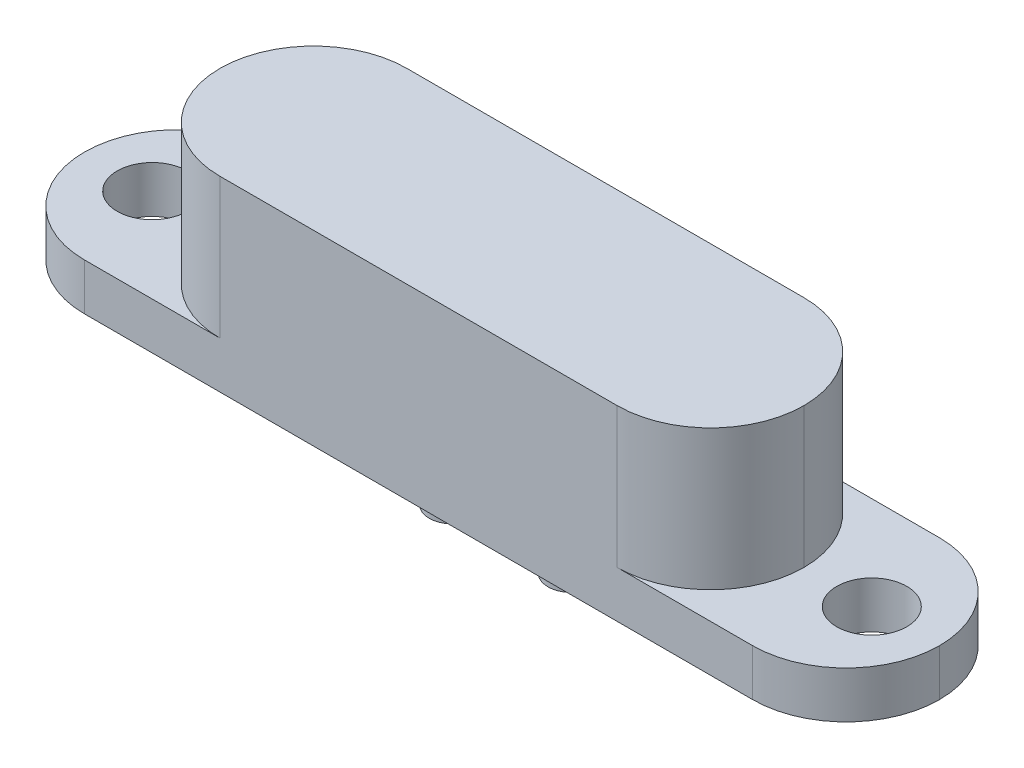
ISO-10303-21;
HEADER;
FILE_DESCRIPTION(('STEP AP214'),'2;1');
FILE_NAME('part.step','',(''),(''),'','','');
FILE_SCHEMA(('AUTOMOTIVE_DESIGN { 1 0 10303 214 1 1 1 1 }'));
ENDSEC;
DATA;
#1=APPLICATION_CONTEXT('core data for automotive mechanical design processes');
#2=APPLICATION_PROTOCOL_DEFINITION('international standard','automotive_design',2000,#1);
#3=PRODUCT_CONTEXT('',#1,'mechanical');
#4=PRODUCT('Part','Part','',(#3));
#5=PRODUCT_RELATED_PRODUCT_CATEGORY('part','',(#4));
#6=PRODUCT_DEFINITION_FORMATION('','',#4);
#7=PRODUCT_DEFINITION_CONTEXT('part definition',#1,'design');
#8=PRODUCT_DEFINITION('design','',#6,#7);
#9=PRODUCT_DEFINITION_SHAPE('','',#8);
#10=(LENGTH_UNIT() NAMED_UNIT(*) SI_UNIT(.MILLI.,.METRE.));
#11=(NAMED_UNIT(*) PLANE_ANGLE_UNIT() SI_UNIT($,.RADIAN.));
#12=(NAMED_UNIT(*) SI_UNIT($,.STERADIAN.) SOLID_ANGLE_UNIT());
#13=UNCERTAINTY_MEASURE_WITH_UNIT(LENGTH_MEASURE(1.E-05),#10,'distance_accuracy_value','');
#14=(GEOMETRIC_REPRESENTATION_CONTEXT(3) GLOBAL_UNCERTAINTY_ASSIGNED_CONTEXT((#13)) GLOBAL_UNIT_ASSIGNED_CONTEXT((#10,
#11,#12)) REPRESENTATION_CONTEXT('',''));
#15=CARTESIAN_POINT('',(0.,0.,0.));
#16=DIRECTION('',(0.,0.,1.));
#17=DIRECTION('',(1.,0.,0.));
#18=AXIS2_PLACEMENT_3D('',#15,#16,#17);
#19=CARTESIAN_POINT('',(-6.25,4.,2.));
#20=DIRECTION('',(0.,0.,-1.));
#21=DIRECTION('',(-1.,0.,0.));
#22=AXIS2_PLACEMENT_3D('',#19,#20,#21);
#23=PLANE('',#22);
#24=DIRECTION('',(1.,0.,0.));
#25=VECTOR('',#24,1.);
#26=CARTESIAN_POINT('',(-6.25,0.,2.));
#27=LINE('',#26,#25);
#28=CARTESIAN_POINT('',(-7.15,0.,2.));
#29=VERTEX_POINT('',#28);
#30=CARTESIAN_POINT('',(7.15,0.,2.));
#31=VERTEX_POINT('',#30);
#32=EDGE_CURVE('E166',#29,#31,#27,.T.);
#33=ORIENTED_EDGE('',*,*,#32,.T.);
#34=DIRECTION('',(0.,-1.,0.));
#35=VECTOR('',#34,1.);
#36=CARTESIAN_POINT('',(7.15,4.,2.));
#37=LINE('',#36,#35);
#38=CARTESIAN_POINT('',(7.15,1.,2.));
#39=VERTEX_POINT('',#38);
#40=EDGE_CURVE('E178',#31,#39,#37,.F.);
#41=ORIENTED_EDGE('',*,*,#40,.T.);
#42=DIRECTION('',(1.,0.,0.));
#43=VECTOR('',#42,1.);
#44=CARTESIAN_POINT('',(-9.15,1.,2.));
#45=LINE('',#44,#43);
#46=CARTESIAN_POINT('',(4.25,1.,2.));
#47=VERTEX_POINT('',#46);
#48=EDGE_CURVE('E139',#47,#39,#45,.T.);
#49=ORIENTED_EDGE('',*,*,#48,.F.);
#50=DIRECTION('',(0.,-1.,0.));
#51=VECTOR('',#50,1.);
#52=CARTESIAN_POINT('',(4.25,4.,2.));
#53=LINE('',#52,#51);
#54=CARTESIAN_POINT('',(4.25,4.,2.));
#55=VERTEX_POINT('',#54);
#56=EDGE_CURVE('E150',#47,#55,#53,.F.);
#57=ORIENTED_EDGE('',*,*,#56,.T.);
#58=DIRECTION('',(1.,0.,0.));
#59=VECTOR('',#58,1.);
#60=CARTESIAN_POINT('',(-6.25,4.,2.));
#61=LINE('',#60,#59);
#62=CARTESIAN_POINT('',(-4.25,4.,2.));
#63=VERTEX_POINT('',#62);
#64=EDGE_CURVE('E155',#63,#55,#61,.T.);
#65=ORIENTED_EDGE('',*,*,#64,.F.);
#66=DIRECTION('',(0.,-1.,0.));
#67=VECTOR('',#66,1.);
#68=CARTESIAN_POINT('',(-4.25,0.,2.));
#69=LINE('',#68,#67);
#70=CARTESIAN_POINT('',(-4.25,1.,2.));
#71=VERTEX_POINT('',#70);
#72=EDGE_CURVE('E146',#63,#71,#69,.T.);
#73=ORIENTED_EDGE('',*,*,#72,.T.);
#74=CARTESIAN_POINT('',(-7.15,1.,2.));
#75=VERTEX_POINT('',#74);
#76=EDGE_CURVE('E127',#75,#71,#45,.T.);
#77=ORIENTED_EDGE('',*,*,#76,.F.);
#78=DIRECTION('',(0.,-1.,0.));
#79=VECTOR('',#78,1.);
#80=CARTESIAN_POINT('',(-7.15,0.,2.));
#81=LINE('',#80,#79);
#82=EDGE_CURVE('E176',#75,#29,#81,.T.);
#83=ORIENTED_EDGE('',*,*,#82,.T.);
#84=EDGE_LOOP('',(#33,#41,#49,#57,#65,#73,#77,#83));
#85=FACE_BOUND('',#84,.T.);
#86=ADVANCED_FACE('F39',(#85),#23,.F.);
#87=CARTESIAN_POINT('',(-6.25,4.,-2.));
#88=DIRECTION('',(0.,0.,-1.));
#89=DIRECTION('',(-1.,0.,0.));
#90=AXIS2_PLACEMENT_3D('',#87,#88,#89);
#91=PLANE('',#90);
#92=DIRECTION('',(1.,0.,0.));
#93=VECTOR('',#92,1.);
#94=CARTESIAN_POINT('',(-9.15,1.,-2.));
#95=LINE('',#94,#93);
#96=CARTESIAN_POINT('',(4.25,1.,-2.));
#97=VERTEX_POINT('',#96);
#98=CARTESIAN_POINT('',(7.15,1.,-2.));
#99=VERTEX_POINT('',#98);
#100=EDGE_CURVE('E138',#97,#99,#95,.T.);
#101=ORIENTED_EDGE('',*,*,#100,.T.);
#102=DIRECTION('',(0.,-1.,0.));
#103=VECTOR('',#102,1.);
#104=CARTESIAN_POINT('',(7.15,0.,-2.));
#105=LINE('',#104,#103);
#106=CARTESIAN_POINT('',(7.15,0.,-2.));
#107=VERTEX_POINT('',#106);
#108=EDGE_CURVE('E186',#99,#107,#105,.T.);
#109=ORIENTED_EDGE('',*,*,#108,.T.);
#110=DIRECTION('',(1.,0.,0.));
#111=VECTOR('',#110,1.);
#112=CARTESIAN_POINT('',(-6.25,0.,-2.));
#113=LINE('',#112,#111);
#114=CARTESIAN_POINT('',(-7.15,0.,-2.));
#115=VERTEX_POINT('',#114);
#116=EDGE_CURVE('E228',#115,#107,#113,.T.);
#117=ORIENTED_EDGE('',*,*,#116,.F.);
#118=DIRECTION('',(0.,-1.,0.));
#119=VECTOR('',#118,1.);
#120=CARTESIAN_POINT('',(-7.15,4.,-2.));
#121=LINE('',#120,#119);
#122=CARTESIAN_POINT('',(-7.15,1.,-2.));
#123=VERTEX_POINT('',#122);
#124=EDGE_CURVE('E62',#115,#123,#121,.F.);
#125=ORIENTED_EDGE('',*,*,#124,.T.);
#126=CARTESIAN_POINT('',(-4.25,1.,-2.));
#127=VERTEX_POINT('',#126);
#128=EDGE_CURVE('E219',#123,#127,#95,.T.);
#129=ORIENTED_EDGE('',*,*,#128,.T.);
#130=DIRECTION('',(0.,-1.,0.));
#131=VECTOR('',#130,1.);
#132=CARTESIAN_POINT('',(-4.25,4.,-2.));
#133=LINE('',#132,#131);
#134=CARTESIAN_POINT('',(-4.25,4.,-2.));
#135=VERTEX_POINT('',#134);
#136=EDGE_CURVE('E231',#127,#135,#133,.F.);
#137=ORIENTED_EDGE('',*,*,#136,.T.);
#138=DIRECTION('',(1.,0.,0.));
#139=VECTOR('',#138,1.);
#140=CARTESIAN_POINT('',(-6.25,4.,-2.));
#141=LINE('',#140,#139);
#142=CARTESIAN_POINT('',(4.25,4.,-2.));
#143=VERTEX_POINT('',#142);
#144=EDGE_CURVE('E227',#135,#143,#141,.T.);
#145=ORIENTED_EDGE('',*,*,#144,.T.);
#146=DIRECTION('',(0.,-1.,0.));
#147=VECTOR('',#146,1.);
#148=CARTESIAN_POINT('',(4.25,0.,-2.));
#149=LINE('',#148,#147);
#150=EDGE_CURVE('E236',#143,#97,#149,.T.);
#151=ORIENTED_EDGE('',*,*,#150,.T.);
#152=EDGE_LOOP('',(#101,#109,#117,#125,#129,#137,#145,#151));
#153=FACE_BOUND('',#152,.T.);
#154=ADVANCED_FACE('F257',(#153),#91,.T.);
#155=CARTESIAN_POINT('',(0.,4.,0.));
#156=DIRECTION('',(0.,1.,0.));
#157=DIRECTION('',(0.,0.,1.));
#158=AXIS2_PLACEMENT_3D('',#155,#156,#157);
#159=PLANE('',#158);
#160=CARTESIAN_POINT('',(4.25,4.,0.));
#161=DIRECTION('',(0.,1.,0.));
#162=DIRECTION('',(0.,0.,1.));
#163=AXIS2_PLACEMENT_3D('',#160,#161,#162);
#164=CIRCLE('',#163,2.);
#165=CARTESIAN_POINT('',(6.25,4.,0.));
#166=VERTEX_POINT('',#165);
#167=EDGE_CURVE('E159',#55,#166,#164,.T.);
#168=ORIENTED_EDGE('',*,*,#167,.T.);
#169=CARTESIAN_POINT('',(4.25,4.,0.));
#170=DIRECTION('',(0.,1.,0.));
#171=DIRECTION('',(0.,0.,1.));
#172=AXIS2_PLACEMENT_3D('',#169,#170,#171);
#173=CIRCLE('',#172,2.);
#174=EDGE_CURVE('E156',#166,#143,#173,.T.);
#175=ORIENTED_EDGE('',*,*,#174,.T.);
#176=ORIENTED_EDGE('',*,*,#144,.F.);
#177=CARTESIAN_POINT('',(-4.25,4.,0.));
#178=DIRECTION('',(0.,1.,0.));
#179=DIRECTION('',(0.,0.,1.));
#180=AXIS2_PLACEMENT_3D('',#177,#178,#179);
#181=CIRCLE('',#180,2.);
#182=CARTESIAN_POINT('',(-6.25,4.,0.));
#183=VERTEX_POINT('',#182);
#184=EDGE_CURVE('E239',#135,#183,#181,.T.);
#185=ORIENTED_EDGE('',*,*,#184,.T.);
#186=CARTESIAN_POINT('',(-4.25,4.,0.));
#187=DIRECTION('',(0.,1.,0.));
#188=DIRECTION('',(0.,0.,1.));
#189=AXIS2_PLACEMENT_3D('',#186,#187,#188);
#190=CIRCLE('',#189,2.);
#191=EDGE_CURVE('E241',#183,#63,#190,.T.);
#192=ORIENTED_EDGE('',*,*,#191,.T.);
#193=ORIENTED_EDGE('',*,*,#64,.T.);
#194=EDGE_LOOP('',(#168,#175,#176,#185,#192,#193));
#195=FACE_BOUND('',#194,.T.);
#196=ADVANCED_FACE('F245',(#195),#159,.T.);
#197=CARTESIAN_POINT('',(0.,0.,0.));
#198=DIRECTION('',(0.,1.,0.));
#199=DIRECTION('',(0.,0.,1.));
#200=AXIS2_PLACEMENT_3D('',#197,#198,#199);
#201=PLANE('',#200);
#202=CARTESIAN_POINT('',(1.27,0.,0.));
#203=DIRECTION('',(0.,1.,0.));
#204=DIRECTION('',(0.,0.,1.));
#205=AXIS2_PLACEMENT_3D('',#202,#203,#204);
#206=CIRCLE('',#205,0.5);
#207=CARTESIAN_POINT('',(1.27,0.,0.5));
#208=VERTEX_POINT('',#207);
#209=EDGE_CURVE('E43',#208,#208,#206,.T.);
#210=ORIENTED_EDGE('',*,*,#209,.T.);
#211=EDGE_LOOP('',(#210));
#212=FACE_BOUND('',#211,.T.);
#213=CARTESIAN_POINT('',(-1.27,0.,0.));
#214=DIRECTION('',(0.,1.,0.));
#215=DIRECTION('',(0.,0.,1.));
#216=AXIS2_PLACEMENT_3D('',#213,#214,#215);
#217=CIRCLE('',#216,0.5);
#218=CARTESIAN_POINT('',(-1.27,0.,0.5));
#219=VERTEX_POINT('',#218);
#220=EDGE_CURVE('E195',#219,#219,#217,.T.);
#221=ORIENTED_EDGE('',*,*,#220,.T.);
#222=EDGE_LOOP('',(#221));
#223=FACE_BOUND('',#222,.T.);
#224=CARTESIAN_POINT('',(-7.7,0.,0.));
#225=DIRECTION('',(0.,1.,0.));
#226=DIRECTION('',(0.,0.,1.));
#227=AXIS2_PLACEMENT_3D('',#224,#225,#226);
#228=CIRCLE('',#227,0.75);
#229=CARTESIAN_POINT('',(-7.7,0.,0.75));
#230=VERTEX_POINT('',#229);
#231=EDGE_CURVE('E194',#230,#230,#228,.T.);
#232=ORIENTED_EDGE('',*,*,#231,.T.);
#233=EDGE_LOOP('',(#232));
#234=FACE_BOUND('',#233,.T.);
#235=CARTESIAN_POINT('',(7.7,0.,0.));
#236=DIRECTION('',(0.,1.,0.));
#237=DIRECTION('',(0.,0.,1.));
#238=AXIS2_PLACEMENT_3D('',#235,#236,#237);
#239=CIRCLE('',#238,0.75);
#240=CARTESIAN_POINT('',(7.7,0.,0.75));
#241=VERTEX_POINT('',#240);
#242=EDGE_CURVE('E197',#241,#241,#239,.T.);
#243=ORIENTED_EDGE('',*,*,#242,.T.);
#244=EDGE_LOOP('',(#243));
#245=FACE_BOUND('',#244,.T.);
#246=CARTESIAN_POINT('',(7.15,0.,0.));
#247=DIRECTION('',(0.,1.,0.));
#248=DIRECTION('',(0.,0.,1.));
#249=AXIS2_PLACEMENT_3D('',#246,#247,#248);
#250=CIRCLE('',#249,2.);
#251=CARTESIAN_POINT('',(9.15,0.,0.));
#252=VERTEX_POINT('',#251);
#253=EDGE_CURVE('E172',#107,#252,#250,.F.);
#254=ORIENTED_EDGE('',*,*,#253,.T.);
#255=CARTESIAN_POINT('',(7.15,0.,0.));
#256=DIRECTION('',(0.,1.,0.));
#257=DIRECTION('',(0.,0.,1.));
#258=AXIS2_PLACEMENT_3D('',#255,#256,#257);
#259=CIRCLE('',#258,2.);
#260=EDGE_CURVE('E174',#252,#31,#259,.F.);
#261=ORIENTED_EDGE('',*,*,#260,.T.);
#262=ORIENTED_EDGE('',*,*,#32,.F.);
#263=CARTESIAN_POINT('',(-7.15,0.,0.));
#264=DIRECTION('',(0.,1.,0.));
#265=DIRECTION('',(0.,0.,1.));
#266=AXIS2_PLACEMENT_3D('',#263,#264,#265);
#267=CIRCLE('',#266,2.);
#268=CARTESIAN_POINT('',(-9.15,0.,0.));
#269=VERTEX_POINT('',#268);
#270=EDGE_CURVE('E170',#29,#269,#267,.F.);
#271=ORIENTED_EDGE('',*,*,#270,.T.);
#272=CARTESIAN_POINT('',(-7.15,0.,0.));
#273=DIRECTION('',(0.,1.,0.));
#274=DIRECTION('',(0.,0.,1.));
#275=AXIS2_PLACEMENT_3D('',#272,#273,#274);
#276=CIRCLE('',#275,2.);
#277=EDGE_CURVE('E149',#269,#115,#276,.F.);
#278=ORIENTED_EDGE('',*,*,#277,.T.);
#279=ORIENTED_EDGE('',*,*,#116,.T.);
#280=EDGE_LOOP('',(#254,#261,#262,#271,#278,#279));
#281=FACE_BOUND('',#280,.T.);
#282=ADVANCED_FACE('F270',(#212,#223,#234,#245,#281),#201,.F.);
#283=CARTESIAN_POINT('',(4.25,4.,0.));
#284=DIRECTION('',(0.,-1.,0.));
#285=DIRECTION('',(0.,0.,-1.));
#286=AXIS2_PLACEMENT_3D('',#283,#284,#285);
#287=CYLINDRICAL_SURFACE('',#286,2.);
#288=CARTESIAN_POINT('',(4.25,1.,0.));
#289=DIRECTION('',(0.,1.,0.));
#290=DIRECTION('',(0.,0.,1.));
#291=AXIS2_PLACEMENT_3D('',#288,#289,#290);
#292=CIRCLE('',#291,2.);
#293=CARTESIAN_POINT('',(6.25,1.,0.));
#294=VERTEX_POINT('',#293);
#295=EDGE_CURVE('E167',#294,#47,#292,.F.);
#296=ORIENTED_EDGE('',*,*,#295,.F.);
#297=DIRECTION('',(0.,-1.,0.));
#298=VECTOR('',#297,1.);
#299=CARTESIAN_POINT('',(6.25,4.,0.));
#300=LINE('',#299,#298);
#301=EDGE_CURVE('E163',#166,#294,#300,.T.);
#302=ORIENTED_EDGE('',*,*,#301,.F.);
#303=ORIENTED_EDGE('',*,*,#167,.F.);
#304=ORIENTED_EDGE('',*,*,#56,.F.);
#305=EDGE_LOOP('',(#296,#302,#303,#304));
#306=FACE_BOUND('',#305,.T.);
#307=ADVANCED_FACE('F251',(#306),#287,.T.);
#308=CARTESIAN_POINT('',(4.25,4.,0.));
#309=DIRECTION('',(0.,1.,0.));
#310=DIRECTION('',(0.,0.,1.));
#311=AXIS2_PLACEMENT_3D('',#308,#309,#310);
#312=CYLINDRICAL_SURFACE('',#311,2.);
#313=CARTESIAN_POINT('',(4.25,1.,0.));
#314=DIRECTION('',(0.,1.,0.));
#315=DIRECTION('',(0.,0.,1.));
#316=AXIS2_PLACEMENT_3D('',#313,#314,#315);
#317=CIRCLE('',#316,2.);
#318=EDGE_CURVE('E223',#97,#294,#317,.F.);
#319=ORIENTED_EDGE('',*,*,#318,.F.);
#320=ORIENTED_EDGE('',*,*,#150,.F.);
#321=ORIENTED_EDGE('',*,*,#174,.F.);
#322=ORIENTED_EDGE('',*,*,#301,.T.);
#323=EDGE_LOOP('',(#319,#320,#321,#322));
#324=FACE_BOUND('',#323,.T.);
#325=ADVANCED_FACE('F255',(#324),#312,.T.);
#326=CARTESIAN_POINT('',(-4.25,4.,0.));
#327=DIRECTION('',(0.,-1.,0.));
#328=DIRECTION('',(0.,0.,-1.));
#329=AXIS2_PLACEMENT_3D('',#326,#327,#328);
#330=CYLINDRICAL_SURFACE('',#329,2.);
#331=CARTESIAN_POINT('',(-4.25,1.,0.));
#332=DIRECTION('',(0.,1.,0.));
#333=DIRECTION('',(0.,0.,1.));
#334=AXIS2_PLACEMENT_3D('',#331,#332,#333);
#335=CIRCLE('',#334,2.);
#336=CARTESIAN_POINT('',(-6.25,1.,0.));
#337=VERTEX_POINT('',#336);
#338=EDGE_CURVE('E221',#337,#127,#335,.F.);
#339=ORIENTED_EDGE('',*,*,#338,.F.);
#340=DIRECTION('',(0.,-1.,0.));
#341=VECTOR('',#340,1.);
#342=CARTESIAN_POINT('',(-6.25,4.,0.));
#343=LINE('',#342,#341);
#344=EDGE_CURVE('E148',#183,#337,#343,.T.);
#345=ORIENTED_EDGE('',*,*,#344,.F.);
#346=ORIENTED_EDGE('',*,*,#184,.F.);
#347=ORIENTED_EDGE('',*,*,#136,.F.);
#348=EDGE_LOOP('',(#339,#345,#346,#347));
#349=FACE_BOUND('',#348,.T.);
#350=ADVANCED_FACE('F262',(#349),#330,.T.);
#351=CARTESIAN_POINT('',(-4.25,4.,0.));
#352=DIRECTION('',(0.,1.,0.));
#353=DIRECTION('',(0.,0.,1.));
#354=AXIS2_PLACEMENT_3D('',#351,#352,#353);
#355=CYLINDRICAL_SURFACE('',#354,2.);
#356=CARTESIAN_POINT('',(-4.25,1.,0.));
#357=DIRECTION('',(0.,1.,0.));
#358=DIRECTION('',(0.,0.,1.));
#359=AXIS2_PLACEMENT_3D('',#356,#357,#358);
#360=CIRCLE('',#359,2.);
#361=EDGE_CURVE('E131',#71,#337,#360,.F.);
#362=ORIENTED_EDGE('',*,*,#361,.F.);
#363=ORIENTED_EDGE('',*,*,#72,.F.);
#364=ORIENTED_EDGE('',*,*,#191,.F.);
#365=ORIENTED_EDGE('',*,*,#344,.T.);
#366=EDGE_LOOP('',(#362,#363,#364,#365));
#367=FACE_BOUND('',#366,.T.);
#368=ADVANCED_FACE('F144',(#367),#355,.T.);
#369=CARTESIAN_POINT('',(0.,1.,0.));
#370=DIRECTION('',(0.,1.,0.));
#371=DIRECTION('',(0.,0.,1.));
#372=AXIS2_PLACEMENT_3D('',#369,#370,#371);
#373=PLANE('',#372);
#374=CARTESIAN_POINT('',(-7.7,1.,0.));
#375=DIRECTION('',(0.,1.,0.));
#376=DIRECTION('',(0.,0.,1.));
#377=AXIS2_PLACEMENT_3D('',#374,#375,#376);
#378=CIRCLE('',#377,0.75);
#379=CARTESIAN_POINT('',(-7.7,1.,0.75));
#380=VERTEX_POINT('',#379);
#381=EDGE_CURVE('E214',#380,#380,#378,.T.);
#382=ORIENTED_EDGE('',*,*,#381,.F.);
#383=EDGE_LOOP('',(#382));
#384=FACE_BOUND('',#383,.T.);
#385=CARTESIAN_POINT('',(-7.15,1.,0.));
#386=DIRECTION('',(0.,1.,0.));
#387=DIRECTION('',(0.,0.,1.));
#388=AXIS2_PLACEMENT_3D('',#385,#386,#387);
#389=CIRCLE('',#388,2.);
#390=CARTESIAN_POINT('',(-9.15,1.,0.));
#391=VERTEX_POINT('',#390);
#392=EDGE_CURVE('E48',#123,#391,#389,.T.);
#393=ORIENTED_EDGE('',*,*,#392,.T.);
#394=CARTESIAN_POINT('',(-7.15,1.,0.));
#395=DIRECTION('',(0.,1.,0.));
#396=DIRECTION('',(0.,0.,1.));
#397=AXIS2_PLACEMENT_3D('',#394,#395,#396);
#398=CIRCLE('',#397,2.);
#399=EDGE_CURVE('E11',#391,#75,#398,.T.);
#400=ORIENTED_EDGE('',*,*,#399,.T.);
#401=ORIENTED_EDGE('',*,*,#76,.T.);
#402=ORIENTED_EDGE('',*,*,#361,.T.);
#403=ORIENTED_EDGE('',*,*,#338,.T.);
#404=ORIENTED_EDGE('',*,*,#128,.F.);
#405=EDGE_LOOP('',(#393,#400,#401,#402,#403,#404));
#406=FACE_BOUND('',#405,.T.);
#407=ADVANCED_FACE('F129',(#384,#406),#373,.T.);
#408=CARTESIAN_POINT('',(7.7,1.,0.));
#409=DIRECTION('',(0.,1.,0.));
#410=DIRECTION('',(0.,0.,1.));
#411=AXIS2_PLACEMENT_3D('',#408,#409,#410);
#412=CIRCLE('',#411,0.75);
#413=CARTESIAN_POINT('',(7.7,1.,0.75));
#414=VERTEX_POINT('',#413);
#415=EDGE_CURVE('E202',#414,#414,#412,.T.);
#416=ORIENTED_EDGE('',*,*,#415,.F.);
#417=EDGE_LOOP('',(#416));
#418=FACE_BOUND('',#417,.T.);
#419=ORIENTED_EDGE('',*,*,#48,.T.);
#420=CARTESIAN_POINT('',(7.15,1.,0.));
#421=DIRECTION('',(0.,1.,0.));
#422=DIRECTION('',(0.,0.,1.));
#423=AXIS2_PLACEMENT_3D('',#420,#421,#422);
#424=CIRCLE('',#423,2.);
#425=CARTESIAN_POINT('',(9.15,1.,0.));
#426=VERTEX_POINT('',#425);
#427=EDGE_CURVE('E183',#39,#426,#424,.T.);
#428=ORIENTED_EDGE('',*,*,#427,.T.);
#429=CARTESIAN_POINT('',(7.15,1.,0.));
#430=DIRECTION('',(0.,1.,0.));
#431=DIRECTION('',(0.,0.,1.));
#432=AXIS2_PLACEMENT_3D('',#429,#430,#431);
#433=CIRCLE('',#432,2.);
#434=EDGE_CURVE('E181',#426,#99,#433,.T.);
#435=ORIENTED_EDGE('',*,*,#434,.T.);
#436=ORIENTED_EDGE('',*,*,#100,.F.);
#437=ORIENTED_EDGE('',*,*,#318,.T.);
#438=ORIENTED_EDGE('',*,*,#295,.T.);
#439=EDGE_LOOP('',(#419,#428,#435,#436,#437,#438));
#440=FACE_BOUND('',#439,.T.);
#441=ADVANCED_FACE('F279',(#418,#440),#373,.T.);
#442=CARTESIAN_POINT('',(7.15,4.,0.));
#443=DIRECTION('',(0.,1.,0.));
#444=DIRECTION('',(0.,0.,1.));
#445=AXIS2_PLACEMENT_3D('',#442,#443,#444);
#446=CYLINDRICAL_SURFACE('',#445,2.);
#447=ORIENTED_EDGE('',*,*,#108,.F.);
#448=ORIENTED_EDGE('',*,*,#434,.F.);
#449=DIRECTION('',(0.,-1.,0.));
#450=VECTOR('',#449,1.);
#451=CARTESIAN_POINT('',(9.15,1.,0.));
#452=LINE('',#451,#450);
#453=EDGE_CURVE('E189',#252,#426,#452,.F.);
#454=ORIENTED_EDGE('',*,*,#453,.F.);
#455=ORIENTED_EDGE('',*,*,#253,.F.);
#456=EDGE_LOOP('',(#447,#448,#454,#455));
#457=FACE_BOUND('',#456,.T.);
#458=ADVANCED_FACE('F282',(#457),#446,.T.);
#459=CARTESIAN_POINT('',(7.15,1.,0.));
#460=DIRECTION('',(0.,-1.,0.));
#461=DIRECTION('',(0.,0.,-1.));
#462=AXIS2_PLACEMENT_3D('',#459,#460,#461);
#463=CYLINDRICAL_SURFACE('',#462,2.);
#464=ORIENTED_EDGE('',*,*,#427,.F.);
#465=ORIENTED_EDGE('',*,*,#40,.F.);
#466=ORIENTED_EDGE('',*,*,#260,.F.);
#467=ORIENTED_EDGE('',*,*,#453,.T.);
#468=EDGE_LOOP('',(#464,#465,#466,#467));
#469=FACE_BOUND('',#468,.T.);
#470=ADVANCED_FACE('F275',(#469),#463,.T.);
#471=CARTESIAN_POINT('',(-7.15,1.,0.));
#472=DIRECTION('',(0.,-1.,0.));
#473=DIRECTION('',(0.,0.,-1.));
#474=AXIS2_PLACEMENT_3D('',#471,#472,#473);
#475=CYLINDRICAL_SURFACE('',#474,2.);
#476=DIRECTION('',(0.,-1.,0.));
#477=VECTOR('',#476,1.);
#478=CARTESIAN_POINT('',(-9.15,1.,0.));
#479=LINE('',#478,#477);
#480=EDGE_CURVE('E192',#391,#269,#479,.T.);
#481=ORIENTED_EDGE('',*,*,#480,.F.);
#482=ORIENTED_EDGE('',*,*,#392,.F.);
#483=ORIENTED_EDGE('',*,*,#124,.F.);
#484=ORIENTED_EDGE('',*,*,#277,.F.);
#485=EDGE_LOOP('',(#481,#482,#483,#484));
#486=FACE_BOUND('',#485,.T.);
#487=ADVANCED_FACE('F41',(#486),#475,.T.);
#488=CARTESIAN_POINT('',(-7.15,4.,0.));
#489=DIRECTION('',(0.,1.,0.));
#490=DIRECTION('',(0.,0.,1.));
#491=AXIS2_PLACEMENT_3D('',#488,#489,#490);
#492=CYLINDRICAL_SURFACE('',#491,2.);
#493=ORIENTED_EDGE('',*,*,#399,.F.);
#494=ORIENTED_EDGE('',*,*,#480,.T.);
#495=ORIENTED_EDGE('',*,*,#270,.F.);
#496=ORIENTED_EDGE('',*,*,#82,.F.);
#497=EDGE_LOOP('',(#493,#494,#495,#496));
#498=FACE_BOUND('',#497,.T.);
#499=ADVANCED_FACE('F266',(#498),#492,.T.);
#500=CARTESIAN_POINT('',(7.7,0.,0.));
#501=DIRECTION('',(0.,1.,0.));
#502=DIRECTION('',(0.,0.,1.));
#503=AXIS2_PLACEMENT_3D('',#500,#501,#502);
#504=CYLINDRICAL_SURFACE('',#503,0.75);
#505=ORIENTED_EDGE('',*,*,#242,.F.);
#506=EDGE_LOOP('',(#505));
#507=FACE_BOUND('',#506,.T.);
#508=ORIENTED_EDGE('',*,*,#415,.T.);
#509=EDGE_LOOP('',(#508));
#510=FACE_BOUND('',#509,.T.);
#511=ADVANCED_FACE('F333',(#507,#510),#504,.F.);
#512=CARTESIAN_POINT('',(-7.7,0.,0.));
#513=DIRECTION('',(0.,1.,0.));
#514=DIRECTION('',(0.,0.,1.));
#515=AXIS2_PLACEMENT_3D('',#512,#513,#514);
#516=CYLINDRICAL_SURFACE('',#515,0.75);
#517=ORIENTED_EDGE('',*,*,#231,.F.);
#518=EDGE_LOOP('',(#517));
#519=FACE_BOUND('',#518,.T.);
#520=ORIENTED_EDGE('',*,*,#381,.T.);
#521=EDGE_LOOP('',(#520));
#522=FACE_BOUND('',#521,.T.);
#523=ADVANCED_FACE('F338',(#519,#522),#516,.F.);
#524=CARTESIAN_POINT('',(-1.27,-1.6,0.));
#525=DIRECTION('',(0.,1.,0.));
#526=DIRECTION('',(0.,0.,1.));
#527=AXIS2_PLACEMENT_3D('',#524,#525,#526);
#528=CYLINDRICAL_SURFACE('',#527,0.5);
#529=CARTESIAN_POINT('',(-1.27,-1.6,0.));
#530=DIRECTION('',(0.,1.,0.));
#531=DIRECTION('',(0.,0.,1.));
#532=AXIS2_PLACEMENT_3D('',#529,#530,#531);
#533=CIRCLE('',#532,0.5);
#534=CARTESIAN_POINT('',(-1.27,-1.6,0.5));
#535=VERTEX_POINT('',#534);
#536=EDGE_CURVE('E198',#535,#535,#533,.T.);
#537=ORIENTED_EDGE('',*,*,#536,.T.);
#538=EDGE_LOOP('',(#537));
#539=FACE_BOUND('',#538,.T.);
#540=ORIENTED_EDGE('',*,*,#220,.F.);
#541=EDGE_LOOP('',(#540));
#542=FACE_BOUND('',#541,.T.);
#543=ADVANCED_FACE('F351',(#539,#542),#528,.T.);
#544=CARTESIAN_POINT('',(-1.27,-1.6,0.));
#545=DIRECTION('',(0.,1.,0.));
#546=DIRECTION('',(0.,0.,1.));
#547=AXIS2_PLACEMENT_3D('',#544,#545,#546);
#548=PLANE('',#547);
#549=ORIENTED_EDGE('',*,*,#536,.F.);
#550=EDGE_LOOP('',(#549));
#551=FACE_BOUND('',#550,.T.);
#552=ADVANCED_FACE('F374',(#551),#548,.F.);
#553=CARTESIAN_POINT('',(1.27,-1.6,0.));
#554=DIRECTION('',(0.,1.,0.));
#555=DIRECTION('',(0.,0.,1.));
#556=AXIS2_PLACEMENT_3D('',#553,#554,#555);
#557=CYLINDRICAL_SURFACE('',#556,0.5);
#558=CARTESIAN_POINT('',(1.27,-1.6,0.));
#559=DIRECTION('',(0.,1.,0.));
#560=DIRECTION('',(0.,0.,1.));
#561=AXIS2_PLACEMENT_3D('',#558,#559,#560);
#562=CIRCLE('',#561,0.5);
#563=CARTESIAN_POINT('',(1.27,-1.6,0.5));
#564=VERTEX_POINT('',#563);
#565=EDGE_CURVE('E209',#564,#564,#562,.T.);
#566=ORIENTED_EDGE('',*,*,#565,.T.);
#567=EDGE_LOOP('',(#566));
#568=FACE_BOUND('',#567,.T.);
#569=ORIENTED_EDGE('',*,*,#209,.F.);
#570=EDGE_LOOP('',(#569));
#571=FACE_BOUND('',#570,.T.);
#572=ADVANCED_FACE('F384',(#568,#571),#557,.T.);
#573=CARTESIAN_POINT('',(1.27,-1.6,0.));
#574=DIRECTION('',(0.,1.,0.));
#575=DIRECTION('',(0.,0.,1.));
#576=AXIS2_PLACEMENT_3D('',#573,#574,#575);
#577=PLANE('',#576);
#578=ORIENTED_EDGE('',*,*,#565,.F.);
#579=EDGE_LOOP('',(#578));
#580=FACE_BOUND('',#579,.T.);
#581=ADVANCED_FACE('F395',(#580),#577,.F.);
#582=CLOSED_SHELL('',(#86,#154,#196,#282,#307,#325,#350,#368,#407,#441,#458,#470,#487,#499,#511,
#523,#543,#552,#572,#581));
#583=MANIFOLD_SOLID_BREP('B2',#582);
#584=ADVANCED_BREP_SHAPE_REPRESENTATION('',(#18,#583),#14);
#585=SHAPE_DEFINITION_REPRESENTATION(#9,#584);
ENDSEC;
END-ISO-10303-21;
